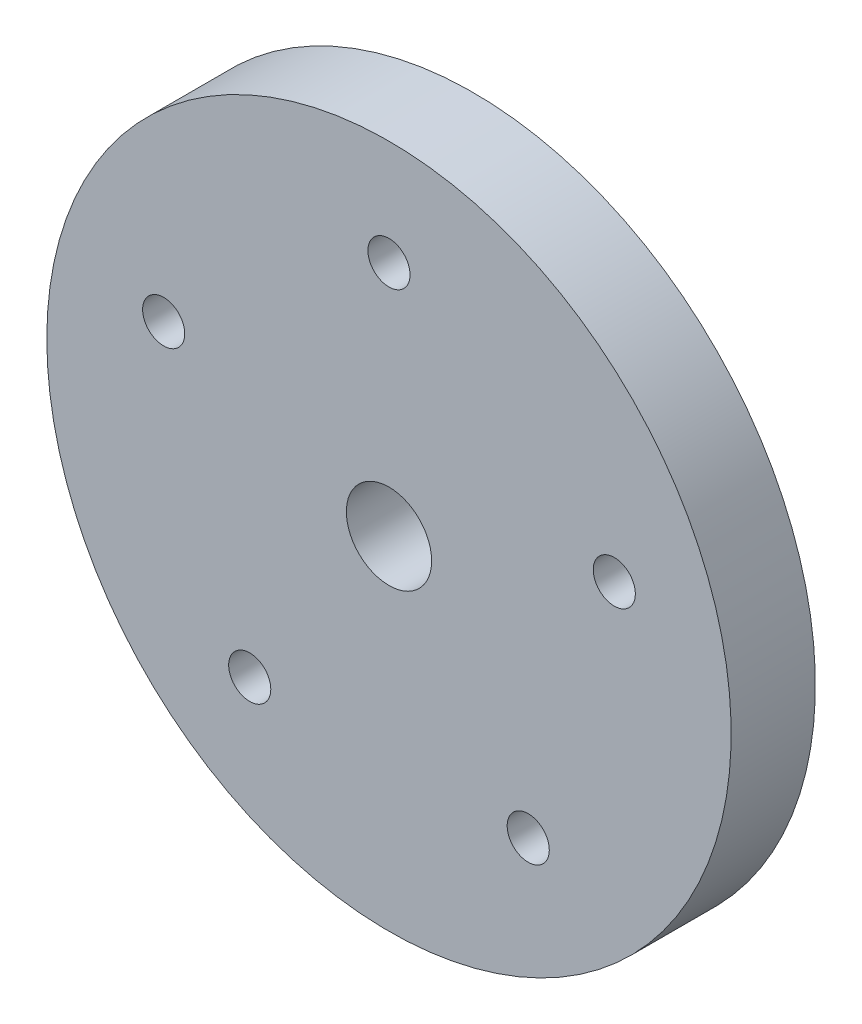
ISO-10303-21;
HEADER;
FILE_DESCRIPTION(('STEP AP214'),'2;1');
FILE_NAME('part.step','',(''),(''),'','','');
FILE_SCHEMA(('AUTOMOTIVE_DESIGN { 1 0 10303 214 1 1 1 1 }'));
ENDSEC;
DATA;
#1=APPLICATION_CONTEXT('core data for automotive mechanical design processes');
#2=APPLICATION_PROTOCOL_DEFINITION('international standard','automotive_design',2000,#1);
#3=PRODUCT_CONTEXT('',#1,'mechanical');
#4=PRODUCT('Part','Part','',(#3));
#5=PRODUCT_RELATED_PRODUCT_CATEGORY('part','',(#4));
#6=PRODUCT_DEFINITION_FORMATION('','',#4);
#7=PRODUCT_DEFINITION_CONTEXT('part definition',#1,'design');
#8=PRODUCT_DEFINITION('design','',#6,#7);
#9=PRODUCT_DEFINITION_SHAPE('','',#8);
#10=(LENGTH_UNIT() NAMED_UNIT(*) SI_UNIT(.MILLI.,.METRE.));
#11=(NAMED_UNIT(*) PLANE_ANGLE_UNIT() SI_UNIT($,.RADIAN.));
#12=(NAMED_UNIT(*) SI_UNIT($,.STERADIAN.) SOLID_ANGLE_UNIT());
#13=UNCERTAINTY_MEASURE_WITH_UNIT(LENGTH_MEASURE(1.E-05),#10,'distance_accuracy_value','');
#14=(GEOMETRIC_REPRESENTATION_CONTEXT(3) GLOBAL_UNCERTAINTY_ASSIGNED_CONTEXT((#13)) GLOBAL_UNIT_ASSIGNED_CONTEXT((#10,
#11,#12)) REPRESENTATION_CONTEXT('',''));
#15=CARTESIAN_POINT('',(0.,0.,0.));
#16=DIRECTION('',(0.,0.,1.));
#17=DIRECTION('',(1.,0.,0.));
#18=AXIS2_PLACEMENT_3D('',#15,#16,#17);
#19=CARTESIAN_POINT('',(0.,32.5,0.));
#20=DIRECTION('',(0.,0.,1.));
#21=DIRECTION('',(1.,0.,0.));
#22=AXIS2_PLACEMENT_3D('',#19,#20,#21);
#23=PLANE('',#22);
#24=CARTESIAN_POINT('',(-21.3987716166409,6.95288237343656,0.));
#25=DIRECTION('',(0.,0.,1.));
#26=DIRECTION('',(1.,0.,0.));
#27=AXIS2_PLACEMENT_3D('',#24,#25,#26);
#28=CIRCLE('',#27,2.);
#29=CARTESIAN_POINT('',(-19.3987716166409,6.95288237343656,0.));
#30=VERTEX_POINT('',#29);
#31=EDGE_CURVE('E101',#30,#30,#28,.T.);
#32=ORIENTED_EDGE('',*,*,#31,.F.);
#33=EDGE_LOOP('',(#32));
#34=FACE_BOUND('',#33,.T.);
#35=CARTESIAN_POINT('',(-13.2251681765808,-18.2028823734362,0.));
#36=DIRECTION('',(0.,0.,1.));
#37=DIRECTION('',(1.,0.,0.));
#38=AXIS2_PLACEMENT_3D('',#35,#36,#37);
#39=CIRCLE('',#38,2.);
#40=CARTESIAN_POINT('',(-11.2251681765808,-18.2028823734362,0.));
#41=VERTEX_POINT('',#40);
#42=EDGE_CURVE('E110',#41,#41,#39,.T.);
#43=ORIENTED_EDGE('',*,*,#42,.F.);
#44=EDGE_LOOP('',(#43));
#45=FACE_BOUND('',#44,.T.);
#46=CARTESIAN_POINT('',(13.2251681765805,-18.2028823734364,0.));
#47=DIRECTION('',(0.,0.,1.));
#48=DIRECTION('',(1.,0.,0.));
#49=AXIS2_PLACEMENT_3D('',#46,#47,#48);
#50=CIRCLE('',#49,2.);
#51=CARTESIAN_POINT('',(15.2251681765805,-18.2028823734364,0.));
#52=VERTEX_POINT('',#51);
#53=EDGE_CURVE('E111',#52,#52,#50,.T.);
#54=ORIENTED_EDGE('',*,*,#53,.F.);
#55=EDGE_LOOP('',(#54));
#56=FACE_BOUND('',#55,.T.);
#57=CARTESIAN_POINT('',(21.398771616641,6.95288237343626,0.));
#58=DIRECTION('',(0.,0.,1.));
#59=DIRECTION('',(1.,0.,0.));
#60=AXIS2_PLACEMENT_3D('',#57,#58,#59);
#61=CIRCLE('',#60,2.);
#62=CARTESIAN_POINT('',(23.398771616641,6.95288237343626,0.));
#63=VERTEX_POINT('',#62);
#64=EDGE_CURVE('E114',#63,#63,#61,.T.);
#65=ORIENTED_EDGE('',*,*,#64,.F.);
#66=EDGE_LOOP('',(#65));
#67=FACE_BOUND('',#66,.T.);
#68=CARTESIAN_POINT('',(0.,0.,0.));
#69=DIRECTION('',(0.,0.,1.));
#70=DIRECTION('',(1.,0.,0.));
#71=AXIS2_PLACEMENT_3D('',#68,#69,#70);
#72=CIRCLE('',#71,4.05);
#73=CARTESIAN_POINT('',(4.05,0.,0.));
#74=VERTEX_POINT('',#73);
#75=EDGE_CURVE('E70',#74,#74,#72,.T.);
#76=ORIENTED_EDGE('',*,*,#75,.F.);
#77=EDGE_LOOP('',(#76));
#78=FACE_BOUND('',#77,.T.);
#79=CARTESIAN_POINT('',(0.,22.5,0.));
#80=DIRECTION('',(0.,0.,1.));
#81=DIRECTION('',(1.,0.,0.));
#82=AXIS2_PLACEMENT_3D('',#79,#80,#81);
#83=CIRCLE('',#82,2.);
#84=CARTESIAN_POINT('',(2.,22.5,0.));
#85=VERTEX_POINT('',#84);
#86=EDGE_CURVE('E60',#85,#85,#83,.T.);
#87=ORIENTED_EDGE('',*,*,#86,.F.);
#88=EDGE_LOOP('',(#87));
#89=FACE_BOUND('',#88,.T.);
#90=CARTESIAN_POINT('',(0.,0.,0.));
#91=DIRECTION('',(0.,0.,-1.));
#92=DIRECTION('',(-1.,0.,0.));
#93=AXIS2_PLACEMENT_3D('',#90,#91,#92);
#94=CIRCLE('',#93,32.5);
#95=CARTESIAN_POINT('',(-32.5,0.,0.));
#96=VERTEX_POINT('',#95);
#97=EDGE_CURVE('E57',#96,#96,#94,.T.);
#98=ORIENTED_EDGE('',*,*,#97,.F.);
#99=EDGE_LOOP('',(#98));
#100=FACE_BOUND('',#99,.T.);
#101=ADVANCED_FACE('F39',(#34,#45,#56,#67,#78,#89,#100),#23,.T.);
#102=CARTESIAN_POINT('',(0.,0.,-20.));
#103=DIRECTION('',(0.,0.,-1.));
#104=DIRECTION('',(-1.,0.,0.));
#105=AXIS2_PLACEMENT_3D('',#102,#103,#104);
#106=PLANE('',#105);
#107=CARTESIAN_POINT('',(0.,10.,-20.));
#108=DIRECTION('',(0.,0.,-1.));
#109=DIRECTION('',(-1.,0.,0.));
#110=AXIS2_PLACEMENT_3D('',#107,#108,#109);
#111=CIRCLE('',#110,1.2);
#112=CARTESIAN_POINT('',(-1.2,10.,-20.));
#113=VERTEX_POINT('',#112);
#114=EDGE_CURVE('E121',#113,#113,#111,.T.);
#115=ORIENTED_EDGE('',*,*,#114,.F.);
#116=EDGE_LOOP('',(#115));
#117=FACE_BOUND('',#116,.T.);
#118=CARTESIAN_POINT('',(-8.66025403784437,-5.00000000000004,-20.));
#119=DIRECTION('',(0.,0.,-1.));
#120=DIRECTION('',(-1.,0.,0.));
#121=AXIS2_PLACEMENT_3D('',#118,#119,#120);
#122=CIRCLE('',#121,1.2);
#123=CARTESIAN_POINT('',(-9.86025403784437,-5.00000000000004,-20.));
#124=VERTEX_POINT('',#123);
#125=EDGE_CURVE('E140',#124,#124,#122,.T.);
#126=ORIENTED_EDGE('',*,*,#125,.F.);
#127=EDGE_LOOP('',(#126));
#128=FACE_BOUND('',#127,.T.);
#129=CARTESIAN_POINT('',(8.66025403784443,-4.99999999999992,-20.));
#130=DIRECTION('',(0.,0.,-1.));
#131=DIRECTION('',(-1.,0.,0.));
#132=AXIS2_PLACEMENT_3D('',#129,#130,#131);
#133=CIRCLE('',#132,1.2);
#134=CARTESIAN_POINT('',(7.46025403784443,-4.99999999999992,-20.));
#135=VERTEX_POINT('',#134);
#136=EDGE_CURVE('E128',#135,#135,#133,.T.);
#137=ORIENTED_EDGE('',*,*,#136,.F.);
#138=EDGE_LOOP('',(#137));
#139=FACE_BOUND('',#138,.T.);
#140=CARTESIAN_POINT('',(0.,0.,-20.));
#141=DIRECTION('',(0.,0.,1.));
#142=DIRECTION('',(1.,0.,0.));
#143=AXIS2_PLACEMENT_3D('',#140,#141,#142);
#144=CIRCLE('',#143,4.04999999999999);
#145=CARTESIAN_POINT('',(4.04999999999999,0.,-20.));
#146=VERTEX_POINT('',#145);
#147=EDGE_CURVE('E64',#146,#146,#144,.T.);
#148=ORIENTED_EDGE('',*,*,#147,.T.);
#149=EDGE_LOOP('',(#148));
#150=FACE_BOUND('',#149,.T.);
#151=CARTESIAN_POINT('',(0.,0.,-20.));
#152=DIRECTION('',(0.,0.,-1.));
#153=DIRECTION('',(-1.,0.,0.));
#154=AXIS2_PLACEMENT_3D('',#151,#152,#153);
#155=CIRCLE('',#154,15.);
#156=CARTESIAN_POINT('',(-15.,0.,-20.));
#157=VERTEX_POINT('',#156);
#158=EDGE_CURVE('E10',#157,#157,#155,.T.);
#159=ORIENTED_EDGE('',*,*,#158,.T.);
#160=EDGE_LOOP('',(#159));
#161=FACE_BOUND('',#160,.T.);
#162=ADVANCED_FACE('F93',(#117,#128,#139,#150,#161),#106,.T.);
#163=CARTESIAN_POINT('',(0.,0.,0.));
#164=DIRECTION('',(0.,0.,-1.));
#165=DIRECTION('',(-1.,0.,0.));
#166=AXIS2_PLACEMENT_3D('',#163,#164,#165);
#167=CYLINDRICAL_SURFACE('',#166,15.);
#168=CARTESIAN_POINT('',(0.,0.,-8.));
#169=DIRECTION('',(0.,0.,-1.));
#170=DIRECTION('',(-1.,0.,0.));
#171=AXIS2_PLACEMENT_3D('',#168,#169,#170);
#172=CIRCLE('',#171,15.);
#173=CARTESIAN_POINT('',(-15.,0.,-8.));
#174=VERTEX_POINT('',#173);
#175=EDGE_CURVE('E46',#174,#174,#172,.T.);
#176=ORIENTED_EDGE('',*,*,#175,.T.);
#177=EDGE_LOOP('',(#176));
#178=FACE_BOUND('',#177,.T.);
#179=ORIENTED_EDGE('',*,*,#158,.F.);
#180=EDGE_LOOP('',(#179));
#181=FACE_BOUND('',#180,.T.);
#182=ADVANCED_FACE('F86',(#178,#181),#167,.T.);
#183=CARTESIAN_POINT('',(0.,15.,-8.));
#184=DIRECTION('',(0.,0.,-1.));
#185=DIRECTION('',(-1.,0.,0.));
#186=AXIS2_PLACEMENT_3D('',#183,#184,#185);
#187=PLANE('',#186);
#188=CARTESIAN_POINT('',(-21.3987716166409,6.95288237343656,-8.));
#189=DIRECTION('',(0.,0.,-1.));
#190=DIRECTION('',(-1.,0.,0.));
#191=AXIS2_PLACEMENT_3D('',#188,#189,#190);
#192=CIRCLE('',#191,2.);
#193=CARTESIAN_POINT('',(-23.3987716166409,6.95288237343656,-8.));
#194=VERTEX_POINT('',#193);
#195=EDGE_CURVE('E148',#194,#194,#192,.T.);
#196=ORIENTED_EDGE('',*,*,#195,.F.);
#197=EDGE_LOOP('',(#196));
#198=FACE_BOUND('',#197,.T.);
#199=CARTESIAN_POINT('',(-13.2251681765808,-18.2028823734362,-8.));
#200=DIRECTION('',(0.,0.,-1.));
#201=DIRECTION('',(-1.,0.,0.));
#202=AXIS2_PLACEMENT_3D('',#199,#200,#201);
#203=CIRCLE('',#202,2.);
#204=CARTESIAN_POINT('',(-15.2251681765808,-18.2028823734362,-8.));
#205=VERTEX_POINT('',#204);
#206=EDGE_CURVE('E147',#205,#205,#203,.T.);
#207=ORIENTED_EDGE('',*,*,#206,.F.);
#208=EDGE_LOOP('',(#207));
#209=FACE_BOUND('',#208,.T.);
#210=CARTESIAN_POINT('',(13.2251681765805,-18.2028823734364,-8.));
#211=DIRECTION('',(0.,0.,-1.));
#212=DIRECTION('',(-1.,0.,0.));
#213=AXIS2_PLACEMENT_3D('',#210,#211,#212);
#214=CIRCLE('',#213,2.);
#215=CARTESIAN_POINT('',(11.2251681765805,-18.2028823734364,-8.));
#216=VERTEX_POINT('',#215);
#217=EDGE_CURVE('E45',#216,#216,#214,.T.);
#218=ORIENTED_EDGE('',*,*,#217,.F.);
#219=EDGE_LOOP('',(#218));
#220=FACE_BOUND('',#219,.T.);
#221=CARTESIAN_POINT('',(21.398771616641,6.95288237343626,-8.));
#222=DIRECTION('',(0.,0.,-1.));
#223=DIRECTION('',(-1.,0.,0.));
#224=AXIS2_PLACEMENT_3D('',#221,#222,#223);
#225=CIRCLE('',#224,2.);
#226=CARTESIAN_POINT('',(19.398771616641,6.95288237343626,-8.));
#227=VERTEX_POINT('',#226);
#228=EDGE_CURVE('E132',#227,#227,#225,.T.);
#229=ORIENTED_EDGE('',*,*,#228,.F.);
#230=EDGE_LOOP('',(#229));
#231=FACE_BOUND('',#230,.T.);
#232=CARTESIAN_POINT('',(0.,22.5,-8.));
#233=DIRECTION('',(0.,0.,-1.));
#234=DIRECTION('',(-1.,0.,0.));
#235=AXIS2_PLACEMENT_3D('',#232,#233,#234);
#236=CIRCLE('',#235,2.);
#237=CARTESIAN_POINT('',(-2.,22.5,-8.));
#238=VERTEX_POINT('',#237);
#239=EDGE_CURVE('E53',#238,#238,#236,.T.);
#240=ORIENTED_EDGE('',*,*,#239,.F.);
#241=EDGE_LOOP('',(#240));
#242=FACE_BOUND('',#241,.T.);
#243=CARTESIAN_POINT('',(0.,0.,-8.));
#244=DIRECTION('',(0.,0.,-1.));
#245=DIRECTION('',(-1.,0.,0.));
#246=AXIS2_PLACEMENT_3D('',#243,#244,#245);
#247=CIRCLE('',#246,32.5);
#248=CARTESIAN_POINT('',(-32.5,0.,-8.));
#249=VERTEX_POINT('',#248);
#250=EDGE_CURVE('E51',#249,#249,#247,.T.);
#251=ORIENTED_EDGE('',*,*,#250,.T.);
#252=EDGE_LOOP('',(#251));
#253=FACE_BOUND('',#252,.T.);
#254=ORIENTED_EDGE('',*,*,#175,.F.);
#255=EDGE_LOOP('',(#254));
#256=FACE_BOUND('',#255,.T.);
#257=ADVANCED_FACE('F72',(#198,#209,#220,#231,#242,#253,#256),#187,.T.);
#258=CARTESIAN_POINT('',(0.,0.,0.));
#259=DIRECTION('',(0.,0.,-1.));
#260=DIRECTION('',(-1.,0.,0.));
#261=AXIS2_PLACEMENT_3D('',#258,#259,#260);
#262=CYLINDRICAL_SURFACE('',#261,32.5);
#263=ORIENTED_EDGE('',*,*,#97,.T.);
#264=EDGE_LOOP('',(#263));
#265=FACE_BOUND('',#264,.T.);
#266=ORIENTED_EDGE('',*,*,#250,.F.);
#267=EDGE_LOOP('',(#266));
#268=FACE_BOUND('',#267,.T.);
#269=ADVANCED_FACE('F80',(#265,#268),#262,.T.);
#270=CARTESIAN_POINT('',(0.,22.5,0.));
#271=DIRECTION('',(0.,0.,1.));
#272=DIRECTION('',(1.,0.,0.));
#273=AXIS2_PLACEMENT_3D('',#270,#271,#272);
#274=CYLINDRICAL_SURFACE('',#273,2.);
#275=ORIENTED_EDGE('',*,*,#239,.T.);
#276=EDGE_LOOP('',(#275));
#277=FACE_BOUND('',#276,.T.);
#278=ORIENTED_EDGE('',*,*,#86,.T.);
#279=EDGE_LOOP('',(#278));
#280=FACE_BOUND('',#279,.T.);
#281=ADVANCED_FACE('F79',(#277,#280),#274,.F.);
#282=CARTESIAN_POINT('',(0.,0.,0.));
#283=DIRECTION('',(0.,0.,1.));
#284=DIRECTION('',(1.,0.,0.));
#285=AXIS2_PLACEMENT_3D('',#282,#283,#284);
#286=CYLINDRICAL_SURFACE('',#285,4.05);
#287=ORIENTED_EDGE('',*,*,#147,.F.);
#288=EDGE_LOOP('',(#287));
#289=FACE_BOUND('',#288,.T.);
#290=ORIENTED_EDGE('',*,*,#75,.T.);
#291=EDGE_LOOP('',(#290));
#292=FACE_BOUND('',#291,.T.);
#293=ADVANCED_FACE('F87',(#289,#292),#286,.F.);
#294=CARTESIAN_POINT('',(8.66025403784443,-4.99999999999992,-13.));
#295=DIRECTION('',(0.,0.,-1.));
#296=DIRECTION('',(-1.,0.,0.));
#297=AXIS2_PLACEMENT_3D('',#294,#295,#296);
#298=CYLINDRICAL_SURFACE('',#297,1.2);
#299=CARTESIAN_POINT('',(8.66025403784443,-4.99999999999992,-13.));
#300=DIRECTION('',(0.,0.,-1.));
#301=DIRECTION('',(-1.,0.,0.));
#302=AXIS2_PLACEMENT_3D('',#299,#300,#301);
#303=CIRCLE('',#302,1.2);
#304=CARTESIAN_POINT('',(7.46025403784443,-4.99999999999992,-13.));
#305=VERTEX_POINT('',#304);
#306=EDGE_CURVE('E130',#305,#305,#303,.T.);
#307=ORIENTED_EDGE('',*,*,#306,.F.);
#308=EDGE_LOOP('',(#307));
#309=FACE_BOUND('',#308,.T.);
#310=ORIENTED_EDGE('',*,*,#136,.T.);
#311=EDGE_LOOP('',(#310));
#312=FACE_BOUND('',#311,.T.);
#313=ADVANCED_FACE('F186',(#309,#312),#298,.F.);
#314=CARTESIAN_POINT('',(8.66025403784443,-4.99999999999992,-13.));
#315=DIRECTION('',(0.,0.,-1.));
#316=DIRECTION('',(-1.,0.,0.));
#317=AXIS2_PLACEMENT_3D('',#314,#315,#316);
#318=PLANE('',#317);
#319=ORIENTED_EDGE('',*,*,#306,.T.);
#320=EDGE_LOOP('',(#319));
#321=FACE_BOUND('',#320,.T.);
#322=ADVANCED_FACE('F183',(#321),#318,.T.);
#323=CARTESIAN_POINT('',(-8.66025403784437,-5.00000000000004,-13.));
#324=DIRECTION('',(0.,0.,-1.));
#325=DIRECTION('',(-1.,0.,0.));
#326=AXIS2_PLACEMENT_3D('',#323,#324,#325);
#327=CYLINDRICAL_SURFACE('',#326,1.2);
#328=CARTESIAN_POINT('',(-8.66025403784437,-5.00000000000004,-13.));
#329=DIRECTION('',(0.,0.,-1.));
#330=DIRECTION('',(-1.,0.,0.));
#331=AXIS2_PLACEMENT_3D('',#328,#329,#330);
#332=CIRCLE('',#331,1.2);
#333=CARTESIAN_POINT('',(-9.86025403784437,-5.00000000000004,-13.));
#334=VERTEX_POINT('',#333);
#335=EDGE_CURVE('E131',#334,#334,#332,.T.);
#336=ORIENTED_EDGE('',*,*,#335,.F.);
#337=EDGE_LOOP('',(#336));
#338=FACE_BOUND('',#337,.T.);
#339=ORIENTED_EDGE('',*,*,#125,.T.);
#340=EDGE_LOOP('',(#339));
#341=FACE_BOUND('',#340,.T.);
#342=ADVANCED_FACE('F181',(#338,#341),#327,.F.);
#343=CARTESIAN_POINT('',(-8.66025403784437,-5.00000000000004,-13.));
#344=DIRECTION('',(0.,0.,-1.));
#345=DIRECTION('',(-1.,0.,0.));
#346=AXIS2_PLACEMENT_3D('',#343,#344,#345);
#347=PLANE('',#346);
#348=ORIENTED_EDGE('',*,*,#335,.T.);
#349=EDGE_LOOP('',(#348));
#350=FACE_BOUND('',#349,.T.);
#351=ADVANCED_FACE('F177',(#350),#347,.T.);
#352=CARTESIAN_POINT('',(0.,10.,-13.));
#353=DIRECTION('',(0.,0.,-1.));
#354=DIRECTION('',(-1.,0.,0.));
#355=AXIS2_PLACEMENT_3D('',#352,#353,#354);
#356=CYLINDRICAL_SURFACE('',#355,1.2);
#357=CARTESIAN_POINT('',(0.,10.,-13.));
#358=DIRECTION('',(0.,0.,-1.));
#359=DIRECTION('',(-1.,0.,0.));
#360=AXIS2_PLACEMENT_3D('',#357,#358,#359);
#361=CIRCLE('',#360,1.2);
#362=CARTESIAN_POINT('',(-1.2,10.,-13.));
#363=VERTEX_POINT('',#362);
#364=EDGE_CURVE('E125',#363,#363,#361,.T.);
#365=ORIENTED_EDGE('',*,*,#364,.F.);
#366=EDGE_LOOP('',(#365));
#367=FACE_BOUND('',#366,.T.);
#368=ORIENTED_EDGE('',*,*,#114,.T.);
#369=EDGE_LOOP('',(#368));
#370=FACE_BOUND('',#369,.T.);
#371=ADVANCED_FACE('F174',(#367,#370),#356,.F.);
#372=CARTESIAN_POINT('',(0.,10.,-13.));
#373=DIRECTION('',(0.,0.,-1.));
#374=DIRECTION('',(-1.,0.,0.));
#375=AXIS2_PLACEMENT_3D('',#372,#373,#374);
#376=PLANE('',#375);
#377=ORIENTED_EDGE('',*,*,#364,.T.);
#378=EDGE_LOOP('',(#377));
#379=FACE_BOUND('',#378,.T.);
#380=ADVANCED_FACE('F175',(#379),#376,.T.);
#381=CARTESIAN_POINT('',(21.398771616641,6.95288237343626,0.));
#382=DIRECTION('',(0.,0.,1.));
#383=DIRECTION('',(1.,0.,0.));
#384=AXIS2_PLACEMENT_3D('',#381,#382,#383);
#385=CYLINDRICAL_SURFACE('',#384,2.);
#386=ORIENTED_EDGE('',*,*,#228,.T.);
#387=EDGE_LOOP('',(#386));
#388=FACE_BOUND('',#387,.T.);
#389=ORIENTED_EDGE('',*,*,#64,.T.);
#390=EDGE_LOOP('',(#389));
#391=FACE_BOUND('',#390,.T.);
#392=ADVANCED_FACE('F166',(#388,#391),#385,.F.);
#393=CARTESIAN_POINT('',(13.2251681765805,-18.2028823734364,0.));
#394=DIRECTION('',(0.,0.,1.));
#395=DIRECTION('',(1.,0.,0.));
#396=AXIS2_PLACEMENT_3D('',#393,#394,#395);
#397=CYLINDRICAL_SURFACE('',#396,2.);
#398=ORIENTED_EDGE('',*,*,#217,.T.);
#399=EDGE_LOOP('',(#398));
#400=FACE_BOUND('',#399,.T.);
#401=ORIENTED_EDGE('',*,*,#53,.T.);
#402=EDGE_LOOP('',(#401));
#403=FACE_BOUND('',#402,.T.);
#404=ADVANCED_FACE('F162',(#400,#403),#397,.F.);
#405=CARTESIAN_POINT('',(-13.2251681765808,-18.2028823734362,0.));
#406=DIRECTION('',(0.,0.,1.));
#407=DIRECTION('',(1.,0.,0.));
#408=AXIS2_PLACEMENT_3D('',#405,#406,#407);
#409=CYLINDRICAL_SURFACE('',#408,2.);
#410=ORIENTED_EDGE('',*,*,#206,.T.);
#411=EDGE_LOOP('',(#410));
#412=FACE_BOUND('',#411,.T.);
#413=ORIENTED_EDGE('',*,*,#42,.T.);
#414=EDGE_LOOP('',(#413));
#415=FACE_BOUND('',#414,.T.);
#416=ADVANCED_FACE('F156',(#412,#415),#409,.F.);
#417=CARTESIAN_POINT('',(-21.3987716166409,6.95288237343656,0.));
#418=DIRECTION('',(0.,0.,1.));
#419=DIRECTION('',(1.,0.,0.));
#420=AXIS2_PLACEMENT_3D('',#417,#418,#419);
#421=CYLINDRICAL_SURFACE('',#420,2.);
#422=ORIENTED_EDGE('',*,*,#195,.T.);
#423=EDGE_LOOP('',(#422));
#424=FACE_BOUND('',#423,.T.);
#425=ORIENTED_EDGE('',*,*,#31,.T.);
#426=EDGE_LOOP('',(#425));
#427=FACE_BOUND('',#426,.T.);
#428=ADVANCED_FACE('F151',(#424,#427),#421,.F.);
#429=CLOSED_SHELL('',(#101,#162,#182,#257,#269,#281,#293,#313,#322,#342,#351,#371,#380,#392,
#404,#416,#428));
#430=MANIFOLD_SOLID_BREP('B2',#429);
#431=ADVANCED_BREP_SHAPE_REPRESENTATION('',(#18,#430),#14);
#432=SHAPE_DEFINITION_REPRESENTATION(#9,#431);
ENDSEC;
END-ISO-10303-21;
